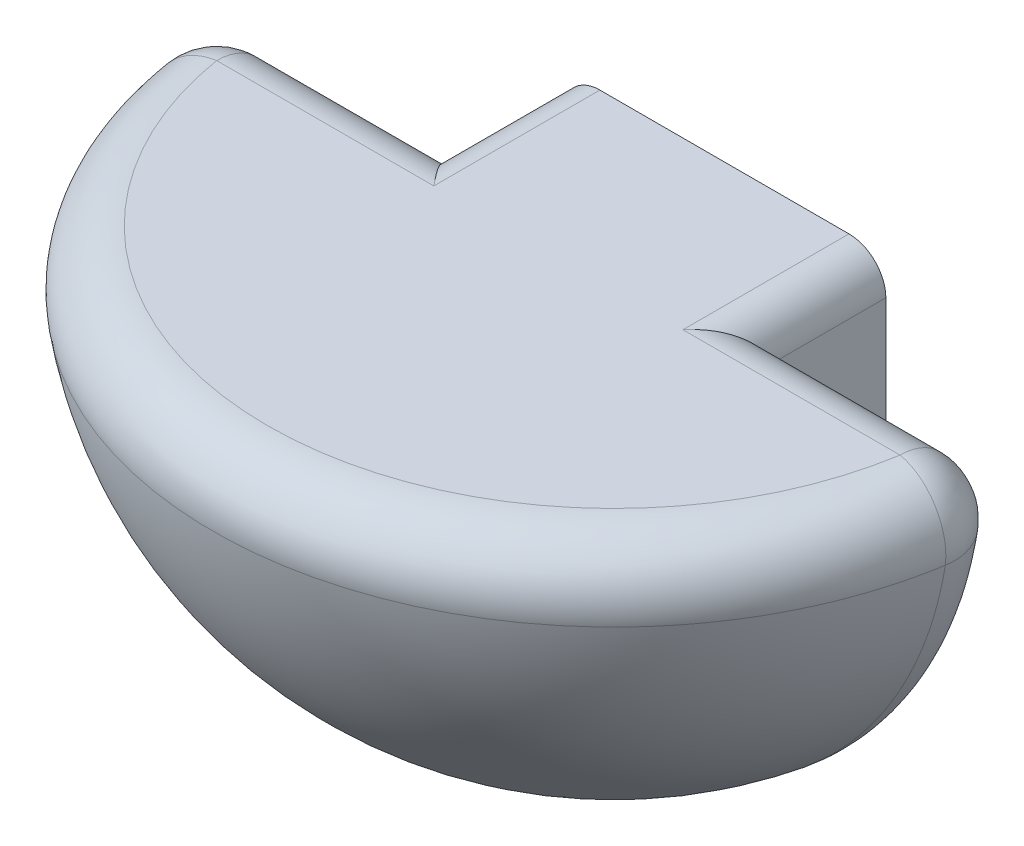
ISO-10303-21;
HEADER;
FILE_DESCRIPTION(('STEP AP214'),'2;1');
FILE_NAME('part.step','',(''),(''),'','','');
FILE_SCHEMA(('AUTOMOTIVE_DESIGN { 1 0 10303 214 1 1 1 1 }'));
ENDSEC;
DATA;
#1=APPLICATION_CONTEXT('core data for automotive mechanical design processes');
#2=APPLICATION_PROTOCOL_DEFINITION('international standard','automotive_design',2000,#1);
#3=PRODUCT_CONTEXT('',#1,'mechanical');
#4=PRODUCT('Part','Part','',(#3));
#5=PRODUCT_RELATED_PRODUCT_CATEGORY('part','',(#4));
#6=PRODUCT_DEFINITION_FORMATION('','',#4);
#7=PRODUCT_DEFINITION_CONTEXT('part definition',#1,'design');
#8=PRODUCT_DEFINITION('design','',#6,#7);
#9=PRODUCT_DEFINITION_SHAPE('','',#8);
#10=(LENGTH_UNIT() NAMED_UNIT(*) SI_UNIT(.MILLI.,.METRE.));
#11=(NAMED_UNIT(*) PLANE_ANGLE_UNIT() SI_UNIT($,.RADIAN.));
#12=(NAMED_UNIT(*) SI_UNIT($,.STERADIAN.) SOLID_ANGLE_UNIT());
#13=UNCERTAINTY_MEASURE_WITH_UNIT(LENGTH_MEASURE(1.E-05),#10,'distance_accuracy_value','');
#14=(GEOMETRIC_REPRESENTATION_CONTEXT(3) GLOBAL_UNCERTAINTY_ASSIGNED_CONTEXT((#13)) GLOBAL_UNIT_ASSIGNED_CONTEXT((#10,
#11,#12)) REPRESENTATION_CONTEXT('',''));
#15=CARTESIAN_POINT('',(0.,0.,0.));
#16=DIRECTION('',(0.,0.,1.));
#17=DIRECTION('',(1.,0.,0.));
#18=AXIS2_PLACEMENT_3D('',#15,#16,#17);
#19=CARTESIAN_POINT('',(0.,0.,0.));
#20=DIRECTION('',(0.,0.,1.));
#21=DIRECTION('',(1.,0.,0.));
#22=AXIS2_PLACEMENT_3D('',#19,#20,#21);
#23=PLANE('',#22);
#24=DIRECTION('',(-1.,0.,0.));
#25=VECTOR('',#24,1.);
#26=CARTESIAN_POINT('',(4.375,-8.75,0.));
#27=LINE('',#26,#25);
#28=CARTESIAN_POINT('',(3.375,-8.75,0.));
#29=VERTEX_POINT('',#28);
#30=CARTESIAN_POINT('',(-3.375,-8.75,0.));
#31=VERTEX_POINT('',#30);
#32=EDGE_CURVE('E263',#29,#31,#27,.T.);
#33=ORIENTED_EDGE('',*,*,#32,.F.);
#34=CARTESIAN_POINT('',(3.375,-7.75,0.));
#35=DIRECTION('',(0.,0.,1.));
#36=DIRECTION('',(1.,0.,0.));
#37=AXIS2_PLACEMENT_3D('',#34,#35,#36);
#38=CIRCLE('',#37,1.);
#39=CARTESIAN_POINT('',(3.38200071590122,-8.74997549468818,0.));
#40=VERTEX_POINT('',#39);
#41=EDGE_CURVE('E406',#29,#40,#38,.T.);
#42=ORIENTED_EDGE('',*,*,#41,.T.);
#43=CARTESIAN_POINT('',(0.,0.,0.));
#44=DIRECTION('',(0.,0.,1.));
#45=DIRECTION('',(1.,0.,0.));
#46=AXIS2_PLACEMENT_3D('',#43,#44,#45);
#47=CIRCLE('',#46,9.38083151964686);
#48=CARTESIAN_POINT('',(-3.38200071590122,-8.74997549468818,0.));
#49=VERTEX_POINT('',#48);
#50=EDGE_CURVE('E64',#40,#49,#47,.F.);
#51=ORIENTED_EDGE('',*,*,#50,.T.);
#52=CARTESIAN_POINT('',(-3.375,-7.75,0.));
#53=DIRECTION('',(0.,0.,1.));
#54=DIRECTION('',(1.,0.,0.));
#55=AXIS2_PLACEMENT_3D('',#52,#53,#54);
#56=CIRCLE('',#55,1.);
#57=EDGE_CURVE('E387',#49,#31,#56,.T.);
#58=ORIENTED_EDGE('',*,*,#57,.T.);
#59=EDGE_LOOP('',(#33,#42,#51,#58));
#60=FACE_BOUND('',#59,.T.);
#61=ADVANCED_FACE('F36',(#60),#23,.F.);
#62=DIRECTION('',(0.,1.,0.));
#63=VECTOR('',#62,1.);
#64=CARTESIAN_POINT('',(-4.375,0.,0.));
#65=LINE('',#64,#63);
#66=CARTESIAN_POINT('',(-4.375,-7.75,0.));
#67=VERTEX_POINT('',#66);
#68=CARTESIAN_POINT('',(-4.375,-1.5,0.));
#69=VERTEX_POINT('',#68);
#70=EDGE_CURVE('E251',#67,#69,#65,.T.);
#71=ORIENTED_EDGE('',*,*,#70,.F.);
#72=CARTESIAN_POINT('',(-3.375,-7.75,0.));
#73=DIRECTION('',(0.,0.,1.));
#74=DIRECTION('',(1.,0.,0.));
#75=AXIS2_PLACEMENT_3D('',#72,#73,#74);
#76=CIRCLE('',#75,1.);
#77=CARTESIAN_POINT('',(-4.10233669936263,-8.43628079221303,0.));
#78=VERTEX_POINT('',#77);
#79=EDGE_CURVE('E361',#67,#78,#76,.T.);
#80=ORIENTED_EDGE('',*,*,#79,.T.);
#81=CARTESIAN_POINT('',(0.,0.,0.));
#82=DIRECTION('',(0.,0.,1.));
#83=DIRECTION('',(1.,0.,0.));
#84=AXIS2_PLACEMENT_3D('',#81,#82,#83);
#85=CIRCLE('',#84,9.38083151964686);
#86=CARTESIAN_POINT('',(-9.26012958872607,-1.5,0.));
#87=VERTEX_POINT('',#86);
#88=EDGE_CURVE('E277',#78,#87,#85,.F.);
#89=ORIENTED_EDGE('',*,*,#88,.T.);
#90=DIRECTION('',(-1.,0.,0.));
#91=VECTOR('',#90,1.);
#92=CARTESIAN_POINT('',(-4.375,-1.5,0.));
#93=LINE('',#92,#91);
#94=EDGE_CURVE('E274',#87,#69,#93,.F.);
#95=ORIENTED_EDGE('',*,*,#94,.T.);
#96=EDGE_LOOP('',(#71,#80,#89,#95));
#97=FACE_BOUND('',#96,.T.);
#98=ADVANCED_FACE('F470',(#97),#23,.F.);
#99=DIRECTION('',(-1.,0.,0.));
#100=VECTOR('',#99,1.);
#101=CARTESIAN_POINT('',(11.,-1.5,0.));
#102=LINE('',#101,#100);
#103=CARTESIAN_POINT('',(4.375,-1.5,0.));
#104=VERTEX_POINT('',#103);
#105=CARTESIAN_POINT('',(9.26012958872607,-1.5,0.));
#106=VERTEX_POINT('',#105);
#107=EDGE_CURVE('E271',#104,#106,#102,.F.);
#108=ORIENTED_EDGE('',*,*,#107,.T.);
#109=CARTESIAN_POINT('',(0.,0.,0.));
#110=DIRECTION('',(0.,0.,1.));
#111=DIRECTION('',(1.,0.,0.));
#112=AXIS2_PLACEMENT_3D('',#109,#110,#111);
#113=CIRCLE('',#112,9.38083151964686);
#114=CARTESIAN_POINT('',(4.10233669936262,-8.43628079221304,0.));
#115=VERTEX_POINT('',#114);
#116=EDGE_CURVE('E57',#106,#115,#113,.F.);
#117=ORIENTED_EDGE('',*,*,#116,.T.);
#118=CARTESIAN_POINT('',(3.375,-7.75,0.));
#119=DIRECTION('',(0.,0.,1.));
#120=DIRECTION('',(1.,0.,0.));
#121=AXIS2_PLACEMENT_3D('',#118,#119,#120);
#122=CIRCLE('',#121,1.);
#123=CARTESIAN_POINT('',(4.375,-7.75,0.));
#124=VERTEX_POINT('',#123);
#125=EDGE_CURVE('E50',#115,#124,#122,.T.);
#126=ORIENTED_EDGE('',*,*,#125,.T.);
#127=DIRECTION('',(0.,-1.,0.));
#128=VECTOR('',#127,1.);
#129=CARTESIAN_POINT('',(4.375,0.,0.));
#130=LINE('',#129,#128);
#131=EDGE_CURVE('E246',#104,#124,#130,.T.);
#132=ORIENTED_EDGE('',*,*,#131,.F.);
#133=EDGE_LOOP('',(#108,#117,#126,#132));
#134=FACE_BOUND('',#133,.T.);
#135=ADVANCED_FACE('F409',(#134),#23,.F.);
#136=CARTESIAN_POINT('',(0.,0.,0.));
#137=DIRECTION('',(1.,0.,0.));
#138=DIRECTION('',(0.,0.,1.));
#139=AXIS2_PLACEMENT_3D('',#136,#137,#138);
#140=SPHERICAL_SURFACE('',#139,11.);
#141=CARTESIAN_POINT('',(0.,-1.73684210526316,0.));
#142=DIRECTION('',(0.,1.,0.));
#143=DIRECTION('',(0.,0.,1.));
#144=AXIS2_PLACEMENT_3D('',#141,#142,#143);
#145=CIRCLE('',#144,10.8620154438016);
#146=CARTESIAN_POINT('',(10.7222553132618,-1.73684210526315,1.73684210526316));
#147=VERTEX_POINT('',#146);
#148=CARTESIAN_POINT('',(-10.7222553132618,-1.73684210526315,1.73684210526316));
#149=VERTEX_POINT('',#148);
#150=EDGE_CURVE('E260',#147,#149,#145,.F.);
#151=ORIENTED_EDGE('',*,*,#150,.T.);
#152=CARTESIAN_POINT('',(0.,0.,1.73684210526316));
#153=DIRECTION('',(0.,0.,-1.));
#154=DIRECTION('',(-1.,0.,0.));
#155=AXIS2_PLACEMENT_3D('',#152,#153,#154);
#156=CIRCLE('',#155,10.8620154438016);
#157=EDGE_CURVE('E268',#149,#147,#156,.F.);
#158=ORIENTED_EDGE('',*,*,#157,.T.);
#159=EDGE_LOOP('',(#151,#158));
#160=FACE_BOUND('',#159,.T.);
#161=ADVANCED_FACE('F396',(#160),#140,.T.);
#162=CARTESIAN_POINT('',(0.,0.,0.));
#163=DIRECTION('',(0.,1.,0.));
#164=DIRECTION('',(1.,0.,0.));
#165=AXIS2_PLACEMENT_3D('',#162,#163,#164);
#166=PLANE('',#165);
#167=DIRECTION('',(1.,0.,0.));
#168=VECTOR('',#167,1.);
#169=CARTESIAN_POINT('',(4.375,0.,-3.));
#170=LINE('',#169,#168);
#171=CARTESIAN_POINT('',(-3.375,0.,-3.));
#172=VERTEX_POINT('',#171);
#173=CARTESIAN_POINT('',(3.375,0.,-3.));
#174=VERTEX_POINT('',#173);
#175=EDGE_CURVE('E257',#172,#174,#170,.T.);
#176=ORIENTED_EDGE('',*,*,#175,.F.);
#177=DIRECTION('',(0.,0.,1.));
#178=VECTOR('',#177,1.);
#179=CARTESIAN_POINT('',(-3.375,0.,1.49999999999999));
#180=LINE('',#179,#178);
#181=CARTESIAN_POINT('',(-3.375,0.,1.49999999999999));
#182=VERTEX_POINT('',#181);
#183=EDGE_CURVE('E327',#172,#182,#180,.T.);
#184=ORIENTED_EDGE('',*,*,#183,.T.);
#185=DIRECTION('',(-1.,0.,0.));
#186=VECTOR('',#185,1.);
#187=CARTESIAN_POINT('',(-11.,0.,1.49999999999999));
#188=LINE('',#187,#186);
#189=CARTESIAN_POINT('',(-9.26012958872607,0.,1.49999999999999));
#190=VERTEX_POINT('',#189);
#191=EDGE_CURVE('E284',#182,#190,#188,.T.);
#192=ORIENTED_EDGE('',*,*,#191,.T.);
#193=CARTESIAN_POINT('',(0.,0.,0.));
#194=DIRECTION('',(0.,1.,0.));
#195=DIRECTION('',(0.,0.,1.));
#196=AXIS2_PLACEMENT_3D('',#193,#194,#195);
#197=CIRCLE('',#196,9.38083151964686);
#198=CARTESIAN_POINT('',(9.26012958872607,0.,1.49999999999999));
#199=VERTEX_POINT('',#198);
#200=EDGE_CURVE('E280',#190,#199,#197,.T.);
#201=ORIENTED_EDGE('',*,*,#200,.T.);
#202=DIRECTION('',(-1.,0.,0.));
#203=VECTOR('',#202,1.);
#204=CARTESIAN_POINT('',(4.375,0.,1.49999999999999));
#205=LINE('',#204,#203);
#206=CARTESIAN_POINT('',(3.375,0.,1.49999999999999));
#207=VERTEX_POINT('',#206);
#208=EDGE_CURVE('E282',#199,#207,#205,.T.);
#209=ORIENTED_EDGE('',*,*,#208,.T.);
#210=DIRECTION('',(0.,0.,1.));
#211=VECTOR('',#210,1.);
#212=CARTESIAN_POINT('',(3.375,0.,-3.));
#213=LINE('',#212,#211);
#214=EDGE_CURVE('E325',#207,#174,#213,.F.);
#215=ORIENTED_EDGE('',*,*,#214,.T.);
#216=EDGE_LOOP('',(#176,#184,#192,#201,#209,#215));
#217=FACE_BOUND('',#216,.T.);
#218=ADVANCED_FACE('F444',(#217),#166,.T.);
#219=CARTESIAN_POINT('',(0.,0.,-3.));
#220=DIRECTION('',(0.,0.,-1.));
#221=DIRECTION('',(-1.,0.,0.));
#222=AXIS2_PLACEMENT_3D('',#219,#220,#221);
#223=PLANE('',#222);
#224=DIRECTION('',(0.,1.,0.));
#225=VECTOR('',#224,1.);
#226=CARTESIAN_POINT('',(-4.375,0.,-3.));
#227=LINE('',#226,#225);
#228=CARTESIAN_POINT('',(-4.375,-7.75,-3.));
#229=VERTEX_POINT('',#228);
#230=CARTESIAN_POINT('',(-4.375,-1.00000000000001,-3.));
#231=VERTEX_POINT('',#230);
#232=EDGE_CURVE('E254',#229,#231,#227,.T.);
#233=ORIENTED_EDGE('',*,*,#232,.T.);
#234=CARTESIAN_POINT('',(-3.375,-1.00000000000001,-3.));
#235=DIRECTION('',(0.,0.,-1.));
#236=DIRECTION('',(-1.,0.,0.));
#237=AXIS2_PLACEMENT_3D('',#234,#235,#236);
#238=CIRCLE('',#237,1.);
#239=EDGE_CURVE('E341',#231,#172,#238,.T.);
#240=ORIENTED_EDGE('',*,*,#239,.T.);
#241=ORIENTED_EDGE('',*,*,#175,.T.);
#242=CARTESIAN_POINT('',(3.375,-1.00000000000001,-3.));
#243=DIRECTION('',(0.,0.,-1.));
#244=DIRECTION('',(-1.,0.,0.));
#245=AXIS2_PLACEMENT_3D('',#242,#243,#244);
#246=CIRCLE('',#245,1.);
#247=CARTESIAN_POINT('',(4.375,-1.00000000000001,-3.));
#248=VERTEX_POINT('',#247);
#249=EDGE_CURVE('E335',#174,#248,#246,.T.);
#250=ORIENTED_EDGE('',*,*,#249,.T.);
#251=DIRECTION('',(0.,-1.,0.));
#252=VECTOR('',#251,1.);
#253=CARTESIAN_POINT('',(4.375,0.,-3.));
#254=LINE('',#253,#252);
#255=CARTESIAN_POINT('',(4.375,-7.75,-3.));
#256=VERTEX_POINT('',#255);
#257=EDGE_CURVE('E247',#248,#256,#254,.T.);
#258=ORIENTED_EDGE('',*,*,#257,.T.);
#259=CARTESIAN_POINT('',(3.375,-7.75,-3.));
#260=DIRECTION('',(0.,0.,-1.));
#261=DIRECTION('',(-1.,0.,0.));
#262=AXIS2_PLACEMENT_3D('',#259,#260,#261);
#263=CIRCLE('',#262,1.);
#264=CARTESIAN_POINT('',(3.375,-8.75,-3.));
#265=VERTEX_POINT('',#264);
#266=EDGE_CURVE('E337',#256,#265,#263,.T.);
#267=ORIENTED_EDGE('',*,*,#266,.T.);
#268=DIRECTION('',(-1.,0.,0.));
#269=VECTOR('',#268,1.);
#270=CARTESIAN_POINT('',(4.375,-8.75,-3.));
#271=LINE('',#270,#269);
#272=CARTESIAN_POINT('',(-3.375,-8.75,-3.));
#273=VERTEX_POINT('',#272);
#274=EDGE_CURVE('E250',#265,#273,#271,.T.);
#275=ORIENTED_EDGE('',*,*,#274,.T.);
#276=CARTESIAN_POINT('',(-3.375,-7.75,-3.));
#277=DIRECTION('',(0.,0.,-1.));
#278=DIRECTION('',(-1.,0.,0.));
#279=AXIS2_PLACEMENT_3D('',#276,#277,#278);
#280=CIRCLE('',#279,1.);
#281=EDGE_CURVE('E339',#273,#229,#280,.T.);
#282=ORIENTED_EDGE('',*,*,#281,.T.);
#283=EDGE_LOOP('',(#233,#240,#241,#250,#258,#267,#275,#282));
#284=FACE_BOUND('',#283,.T.);
#285=DIRECTION('',(-1.,0.,0.));
#286=VECTOR('',#285,1.);
#287=CARTESIAN_POINT('',(2.375,-6.75,-3.));
#288=LINE('',#287,#286);
#289=CARTESIAN_POINT('',(1.375,-6.75,-3.));
#290=VERTEX_POINT('',#289);
#291=CARTESIAN_POINT('',(-1.375,-6.75,-3.));
#292=VERTEX_POINT('',#291);
#293=EDGE_CURVE('E237',#290,#292,#288,.T.);
#294=ORIENTED_EDGE('',*,*,#293,.F.);
#295=CARTESIAN_POINT('',(1.375,-5.75,-3.));
#296=DIRECTION('',(0.,0.,-1.));
#297=DIRECTION('',(-1.,0.,0.));
#298=AXIS2_PLACEMENT_3D('',#295,#296,#297);
#299=CIRCLE('',#298,1.);
#300=CARTESIAN_POINT('',(2.375,-5.75,-3.));
#301=VERTEX_POINT('',#300);
#302=EDGE_CURVE('E198',#290,#301,#299,.F.);
#303=ORIENTED_EDGE('',*,*,#302,.T.);
#304=DIRECTION('',(0.,-1.,0.));
#305=VECTOR('',#304,1.);
#306=CARTESIAN_POINT('',(2.375,-2.,-3.));
#307=LINE('',#306,#305);
#308=CARTESIAN_POINT('',(2.375,-3.,-3.));
#309=VERTEX_POINT('',#308);
#310=EDGE_CURVE('E234',#309,#301,#307,.T.);
#311=ORIENTED_EDGE('',*,*,#310,.F.);
#312=CARTESIAN_POINT('',(1.375,-3.,-3.));
#313=DIRECTION('',(0.,0.,-1.));
#314=DIRECTION('',(-1.,0.,0.));
#315=AXIS2_PLACEMENT_3D('',#312,#313,#314);
#316=CIRCLE('',#315,1.);
#317=CARTESIAN_POINT('',(1.375,-2.,-3.));
#318=VERTEX_POINT('',#317);
#319=EDGE_CURVE('E320',#309,#318,#316,.F.);
#320=ORIENTED_EDGE('',*,*,#319,.T.);
#321=DIRECTION('',(1.,0.,0.));
#322=VECTOR('',#321,1.);
#323=CARTESIAN_POINT('',(2.375,-2.,-3.));
#324=LINE('',#323,#322);
#325=CARTESIAN_POINT('',(-1.375,-2.,-3.));
#326=VERTEX_POINT('',#325);
#327=EDGE_CURVE('E243',#326,#318,#324,.T.);
#328=ORIENTED_EDGE('',*,*,#327,.F.);
#329=CARTESIAN_POINT('',(-1.375,-3.,-3.));
#330=DIRECTION('',(0.,0.,-1.));
#331=DIRECTION('',(-1.,0.,0.));
#332=AXIS2_PLACEMENT_3D('',#329,#330,#331);
#333=CIRCLE('',#332,1.);
#334=CARTESIAN_POINT('',(-2.375,-3.,-3.));
#335=VERTEX_POINT('',#334);
#336=EDGE_CURVE('E318',#326,#335,#333,.F.);
#337=ORIENTED_EDGE('',*,*,#336,.T.);
#338=DIRECTION('',(0.,1.,0.));
#339=VECTOR('',#338,1.);
#340=CARTESIAN_POINT('',(-2.375,-2.,-3.));
#341=LINE('',#340,#339);
#342=CARTESIAN_POINT('',(-2.375,-5.75,-3.));
#343=VERTEX_POINT('',#342);
#344=EDGE_CURVE('E240',#343,#335,#341,.T.);
#345=ORIENTED_EDGE('',*,*,#344,.F.);
#346=CARTESIAN_POINT('',(-1.375,-5.75,-3.));
#347=DIRECTION('',(0.,0.,-1.));
#348=DIRECTION('',(-1.,0.,0.));
#349=AXIS2_PLACEMENT_3D('',#346,#347,#348);
#350=CIRCLE('',#349,1.);
#351=EDGE_CURVE('E322',#343,#292,#350,.F.);
#352=ORIENTED_EDGE('',*,*,#351,.T.);
#353=EDGE_LOOP('',(#294,#303,#311,#320,#328,#337,#345,#352));
#354=FACE_BOUND('',#353,.T.);
#355=ADVANCED_FACE('F422',(#284,#354),#223,.T.);
#356=CARTESIAN_POINT('',(4.375,0.,-3.));
#357=DIRECTION('',(-1.,0.,0.));
#358=DIRECTION('',(0.,-1.,0.));
#359=AXIS2_PLACEMENT_3D('',#356,#357,#358);
#360=PLANE('',#359);
#361=ORIENTED_EDGE('',*,*,#131,.T.);
#362=DIRECTION('',(0.,0.,1.));
#363=VECTOR('',#362,1.);
#364=CARTESIAN_POINT('',(4.375,-7.75,-3.));
#365=LINE('',#364,#363);
#366=EDGE_CURVE('E351',#124,#256,#365,.F.);
#367=ORIENTED_EDGE('',*,*,#366,.T.);
#368=ORIENTED_EDGE('',*,*,#257,.F.);
#369=DIRECTION('',(0.,0.,1.));
#370=VECTOR('',#369,1.);
#371=CARTESIAN_POINT('',(4.375,-0.999999999999997,1.5));
#372=LINE('',#371,#370);
#373=CARTESIAN_POINT('',(4.375,-1.,0.0857864376269033));
#374=VERTEX_POINT('',#373);
#375=EDGE_CURVE('E348',#248,#374,#372,.T.);
#376=ORIENTED_EDGE('',*,*,#375,.T.);
#377=CARTESIAN_POINT('',(4.375,-1.5,1.5));
#378=DIRECTION('',(-1.,0.,0.));
#379=DIRECTION('',(0.,-1.,0.));
#380=AXIS2_PLACEMENT_3D('',#377,#378,#379);
#381=CIRCLE('',#380,1.5);
#382=EDGE_CURVE('E289',#374,#104,#381,.T.);
#383=ORIENTED_EDGE('',*,*,#382,.T.);
#384=EDGE_LOOP('',(#361,#367,#368,#376,#383));
#385=FACE_BOUND('',#384,.T.);
#386=ADVANCED_FACE('F415',(#385),#360,.F.);
#387=CARTESIAN_POINT('',(4.375,-8.75,-3.));
#388=DIRECTION('',(0.,1.,0.));
#389=DIRECTION('',(0.,0.,1.));
#390=AXIS2_PLACEMENT_3D('',#387,#388,#389);
#391=PLANE('',#390);
#392=ORIENTED_EDGE('',*,*,#32,.T.);
#393=DIRECTION('',(0.,0.,1.));
#394=VECTOR('',#393,1.);
#395=CARTESIAN_POINT('',(-3.375,-8.75,-3.));
#396=LINE('',#395,#394);
#397=EDGE_CURVE('E346',#31,#273,#396,.F.);
#398=ORIENTED_EDGE('',*,*,#397,.T.);
#399=ORIENTED_EDGE('',*,*,#274,.F.);
#400=DIRECTION('',(0.,0.,1.));
#401=VECTOR('',#400,1.);
#402=CARTESIAN_POINT('',(3.375,-8.75,-3.));
#403=LINE('',#402,#401);
#404=EDGE_CURVE('E343',#265,#29,#403,.T.);
#405=ORIENTED_EDGE('',*,*,#404,.T.);
#406=EDGE_LOOP('',(#392,#398,#399,#405));
#407=FACE_BOUND('',#406,.T.);
#408=ADVANCED_FACE('F426',(#407),#391,.F.);
#409=CARTESIAN_POINT('',(-4.375,0.,-3.));
#410=DIRECTION('',(1.,0.,0.));
#411=DIRECTION('',(0.,1.,0.));
#412=AXIS2_PLACEMENT_3D('',#409,#410,#411);
#413=PLANE('',#412);
#414=CARTESIAN_POINT('',(-4.375,-1.5,1.5));
#415=DIRECTION('',(1.,0.,0.));
#416=DIRECTION('',(0.,1.,0.));
#417=AXIS2_PLACEMENT_3D('',#414,#415,#416);
#418=CIRCLE('',#417,1.5);
#419=CARTESIAN_POINT('',(-4.375,-1.,0.0857864376269033));
#420=VERTEX_POINT('',#419);
#421=EDGE_CURVE('E286',#69,#420,#418,.T.);
#422=ORIENTED_EDGE('',*,*,#421,.T.);
#423=DIRECTION('',(0.,0.,1.));
#424=VECTOR('',#423,1.);
#425=CARTESIAN_POINT('',(-4.375,-1.00000000000001,-3.));
#426=LINE('',#425,#424);
#427=EDGE_CURVE('E333',#420,#231,#426,.F.);
#428=ORIENTED_EDGE('',*,*,#427,.T.);
#429=ORIENTED_EDGE('',*,*,#232,.F.);
#430=DIRECTION('',(0.,0.,1.));
#431=VECTOR('',#430,1.);
#432=CARTESIAN_POINT('',(-4.375,-7.75,-3.));
#433=LINE('',#432,#431);
#434=EDGE_CURVE('E330',#229,#67,#433,.T.);
#435=ORIENTED_EDGE('',*,*,#434,.T.);
#436=ORIENTED_EDGE('',*,*,#70,.T.);
#437=EDGE_LOOP('',(#422,#428,#429,#435,#436));
#438=FACE_BOUND('',#437,.T.);
#439=ADVANCED_FACE('F435',(#438),#413,.F.);
#440=CARTESIAN_POINT('',(2.375,-2.,-3.));
#441=DIRECTION('',(-1.,0.,0.));
#442=DIRECTION('',(0.,-1.,0.));
#443=AXIS2_PLACEMENT_3D('',#440,#441,#442);
#444=PLANE('',#443);
#445=DIRECTION('',(0.,0.,1.));
#446=VECTOR('',#445,1.);
#447=CARTESIAN_POINT('',(2.375,-5.75,0.));
#448=LINE('',#447,#446);
#449=CARTESIAN_POINT('',(2.375,-5.75,4.5));
#450=VERTEX_POINT('',#449);
#451=EDGE_CURVE('E314',#301,#450,#448,.T.);
#452=ORIENTED_EDGE('',*,*,#451,.T.);
#453=DIRECTION('',(0.,-1.,0.));
#454=VECTOR('',#453,1.);
#455=CARTESIAN_POINT('',(2.375,-3.,4.5));
#456=LINE('',#455,#454);
#457=CARTESIAN_POINT('',(2.375,-3.,4.5));
#458=VERTEX_POINT('',#457);
#459=EDGE_CURVE('E217',#458,#450,#456,.T.);
#460=ORIENTED_EDGE('',*,*,#459,.F.);
#461=DIRECTION('',(0.,0.,1.));
#462=VECTOR('',#461,1.);
#463=CARTESIAN_POINT('',(2.375,-3.,-3.));
#464=LINE('',#463,#462);
#465=EDGE_CURVE('E203',#458,#309,#464,.F.);
#466=ORIENTED_EDGE('',*,*,#465,.T.);
#467=ORIENTED_EDGE('',*,*,#310,.T.);
#468=EDGE_LOOP('',(#452,#460,#466,#467));
#469=FACE_BOUND('',#468,.T.);
#470=ADVANCED_FACE('F530',(#469),#444,.T.);
#471=CARTESIAN_POINT('',(2.375,-6.75,-3.));
#472=DIRECTION('',(0.,1.,0.));
#473=DIRECTION('',(0.,0.,1.));
#474=AXIS2_PLACEMENT_3D('',#471,#472,#473);
#475=PLANE('',#474);
#476=ORIENTED_EDGE('',*,*,#293,.T.);
#477=DIRECTION('',(0.,0.,1.));
#478=VECTOR('',#477,1.);
#479=CARTESIAN_POINT('',(-1.375,-6.75,0.));
#480=LINE('',#479,#478);
#481=CARTESIAN_POINT('',(-1.375,-6.75,4.5));
#482=VERTEX_POINT('',#481);
#483=EDGE_CURVE('E202',#292,#482,#480,.T.);
#484=ORIENTED_EDGE('',*,*,#483,.T.);
#485=DIRECTION('',(-1.,0.,0.));
#486=VECTOR('',#485,1.);
#487=CARTESIAN_POINT('',(1.375,-6.75,4.5));
#488=LINE('',#487,#486);
#489=CARTESIAN_POINT('',(1.375,-6.75,4.5));
#490=VERTEX_POINT('',#489);
#491=EDGE_CURVE('E206',#490,#482,#488,.T.);
#492=ORIENTED_EDGE('',*,*,#491,.F.);
#493=DIRECTION('',(0.,0.,1.));
#494=VECTOR('',#493,1.);
#495=CARTESIAN_POINT('',(1.375,-6.75,-3.));
#496=LINE('',#495,#494);
#497=EDGE_CURVE('E191',#490,#290,#496,.F.);
#498=ORIENTED_EDGE('',*,*,#497,.T.);
#499=EDGE_LOOP('',(#476,#484,#492,#498));
#500=FACE_BOUND('',#499,.T.);
#501=ADVANCED_FACE('F207',(#500),#475,.T.);
#502=CARTESIAN_POINT('',(-2.375,-2.,-3.));
#503=DIRECTION('',(1.,0.,0.));
#504=DIRECTION('',(0.,1.,0.));
#505=AXIS2_PLACEMENT_3D('',#502,#503,#504);
#506=PLANE('',#505);
#507=ORIENTED_EDGE('',*,*,#344,.T.);
#508=DIRECTION('',(0.,0.,1.));
#509=VECTOR('',#508,1.);
#510=CARTESIAN_POINT('',(-2.375,-3.,0.));
#511=LINE('',#510,#509);
#512=CARTESIAN_POINT('',(-2.375,-3.,4.5));
#513=VERTEX_POINT('',#512);
#514=EDGE_CURVE('E308',#335,#513,#511,.T.);
#515=ORIENTED_EDGE('',*,*,#514,.T.);
#516=DIRECTION('',(0.,1.,0.));
#517=VECTOR('',#516,1.);
#518=CARTESIAN_POINT('',(-2.375,-5.75,4.5));
#519=LINE('',#518,#517);
#520=CARTESIAN_POINT('',(-2.375,-5.75,4.5));
#521=VERTEX_POINT('',#520);
#522=EDGE_CURVE('E221',#521,#513,#519,.T.);
#523=ORIENTED_EDGE('',*,*,#522,.F.);
#524=DIRECTION('',(0.,0.,1.));
#525=VECTOR('',#524,1.);
#526=CARTESIAN_POINT('',(-2.375,-5.75,-3.));
#527=LINE('',#526,#525);
#528=EDGE_CURVE('E291',#521,#343,#527,.F.);
#529=ORIENTED_EDGE('',*,*,#528,.T.);
#530=EDGE_LOOP('',(#507,#515,#523,#529));
#531=FACE_BOUND('',#530,.T.);
#532=ADVANCED_FACE('F609',(#531),#506,.T.);
#533=CARTESIAN_POINT('',(2.375,-2.,-3.));
#534=DIRECTION('',(0.,-1.,0.));
#535=DIRECTION('',(0.,0.,-1.));
#536=AXIS2_PLACEMENT_3D('',#533,#534,#535);
#537=PLANE('',#536);
#538=DIRECTION('',(0.,0.,1.));
#539=VECTOR('',#538,1.);
#540=CARTESIAN_POINT('',(1.375,-2.,0.));
#541=LINE('',#540,#539);
#542=CARTESIAN_POINT('',(1.375,-2.,4.5));
#543=VERTEX_POINT('',#542);
#544=EDGE_CURVE('E310',#318,#543,#541,.T.);
#545=ORIENTED_EDGE('',*,*,#544,.T.);
#546=DIRECTION('',(1.,0.,0.));
#547=VECTOR('',#546,1.);
#548=CARTESIAN_POINT('',(-1.375,-2.,4.5));
#549=LINE('',#548,#547);
#550=CARTESIAN_POINT('',(-1.375,-2.,4.5));
#551=VERTEX_POINT('',#550);
#552=EDGE_CURVE('E227',#551,#543,#549,.T.);
#553=ORIENTED_EDGE('',*,*,#552,.F.);
#554=DIRECTION('',(0.,0.,1.));
#555=VECTOR('',#554,1.);
#556=CARTESIAN_POINT('',(-1.375,-2.,-3.));
#557=LINE('',#556,#555);
#558=EDGE_CURVE('E312',#551,#326,#557,.F.);
#559=ORIENTED_EDGE('',*,*,#558,.T.);
#560=ORIENTED_EDGE('',*,*,#327,.T.);
#561=EDGE_LOOP('',(#545,#553,#559,#560));
#562=FACE_BOUND('',#561,.T.);
#563=ADVANCED_FACE('F541',(#562),#537,.T.);
#564=CARTESIAN_POINT('',(0.,-1.5,1.5));
#565=DIRECTION('',(1.,0.,0.));
#566=DIRECTION('',(0.,0.,-1.));
#567=AXIS2_PLACEMENT_3D('',#564,#565,#566);
#568=CYLINDRICAL_SURFACE('',#567,1.5);
#569=ORIENTED_EDGE('',*,*,#421,.F.);
#570=ORIENTED_EDGE('',*,*,#94,.F.);
#571=CARTESIAN_POINT('',(-9.26012958872607,-1.5,1.5));
#572=DIRECTION('',(-1.,0.,0.));
#573=DIRECTION('',(0.,0.,1.));
#574=AXIS2_PLACEMENT_3D('',#571,#572,#573);
#575=CIRCLE('',#574,1.5);
#576=EDGE_CURVE('E238',#190,#87,#575,.T.);
#577=ORIENTED_EDGE('',*,*,#576,.F.);
#578=ORIENTED_EDGE('',*,*,#191,.F.);
#579=CARTESIAN_POINT('',(-4.375,-1.,0.0857864376269035));
#580=CARTESIAN_POINT('',(-4.37500245659851,-0.971802901974473,0.0957504327267925));
#581=CARTESIAN_POINT('',(-4.37380738021847,-0.943931978712709,0.106558505063544));
#582=CARTESIAN_POINT('',(-4.36920892277159,-0.889076938486538,0.129724464543538));
#583=CARTESIAN_POINT('',(-4.36580892299368,-0.862091530029374,0.142079955323218));
#584=CARTESIAN_POINT('',(-4.35266945656256,-0.783253180051374,0.181030276949366));
#585=CARTESIAN_POINT('',(-4.33998221575533,-0.732906887924708,0.209727667231376));
#586=CARTESIAN_POINT('',(-4.30465091279108,-0.62638981734038,0.278646388267308));
#587=CARTESIAN_POINT('',(-4.28039604673932,-0.571509006005012,0.320003304038154));
#588=CARTESIAN_POINT('',(-4.22479362246476,-0.469684797266699,0.407755851029772));
#589=CARTESIAN_POINT('',(-4.19341463302554,-0.422778236017532,0.454173322564945));
#590=CARTESIAN_POINT('',(-4.11246395896117,-0.320363597821427,0.569158931155962));
#591=CARTESIAN_POINT('',(-4.06054984805897,-0.268545272277028,0.639350763509645));
#592=CARTESIAN_POINT('',(-3.95064976120977,-0.17923838957407,0.783882988558085));
#593=CARTESIAN_POINT('',(-3.89265547030922,-0.141769790759839,0.85822899570253));
#594=CARTESIAN_POINT('',(-3.76066383639467,-0.0737953538098999,1.02498671923757));
#595=CARTESIAN_POINT('',(-3.68583244466787,-0.046318212592527,1.11796258206983));
#596=CARTESIAN_POINT('',(-3.53393375238207,-0.00963451881458027,1.30533492378494));
#597=CARTESIAN_POINT('',(-3.45687162415319,-0.000388675138542192,1.39972790488185));
#598=CARTESIAN_POINT('',(-3.37826593999989,-4.00859319633417E-06,1.49600005576983));
#599=CARTESIAN_POINT('',(-3.37663294372978,-9.23299383343867E-09,1.49800005952657));
#600=CARTESIAN_POINT('',(-3.375,0.,1.49999999999999));
#601=B_SPLINE_CURVE_WITH_KNOTS('',3,(#579,#580,#581,#582,#583,#584,#585,#586,#587,#588,#589,
#590,#591,#592,#593,#594,#595,#596,#597,#598,#599,#600),.UNSPECIFIED.,.F.,.F.,(4,2,2,2,2,2,2,2,
2,2,4),(0.,0.089636155681015,0.179135176748013,0.356215461300309,0.57367778427353,
0.792118854178609,1.09504447244105,1.39838989836241,1.76428338223859,2.12938744646442,
2.13713342245208),.UNSPECIFIED.);
#602=EDGE_CURVE('E353',#182,#420,#601,.F.);
#603=ORIENTED_EDGE('',*,*,#602,.T.);
#604=EDGE_LOOP('',(#569,#570,#577,#578,#603));
#605=FACE_BOUND('',#604,.T.);
#606=ADVANCED_FACE('F363',(#605),#568,.T.);
#607=CARTESIAN_POINT('',(0.,-1.5,0.));
#608=DIRECTION('',(0.,1.,0.));
#609=DIRECTION('',(0.,0.,1.));
#610=AXIS2_PLACEMENT_3D('',#607,#608,#609);
#611=TOROIDAL_SURFACE('',#610,9.38083151964686,1.5);
#612=CARTESIAN_POINT('',(9.26012958872607,-1.5,1.5));
#613=DIRECTION('',(0.159900537266708,0.,-0.987133130931091));
#614=DIRECTION('',(-0.987133130931091,0.,-0.159900537266708));
#615=AXIS2_PLACEMENT_3D('',#612,#613,#614);
#616=CIRCLE('',#615,1.5);
#617=EDGE_CURVE('E299',#199,#147,#616,.T.);
#618=ORIENTED_EDGE('',*,*,#617,.F.);
#619=ORIENTED_EDGE('',*,*,#200,.F.);
#620=CARTESIAN_POINT('',(-9.26012958872607,-1.5,1.5));
#621=DIRECTION('',(-0.159900537266708,0.,-0.987133130931091));
#622=DIRECTION('',(-0.987133130931091,0.,0.159900537266708));
#623=AXIS2_PLACEMENT_3D('',#620,#621,#622);
#624=CIRCLE('',#623,1.5);
#625=EDGE_CURVE('E302',#149,#190,#624,.T.);
#626=ORIENTED_EDGE('',*,*,#625,.F.);
#627=ORIENTED_EDGE('',*,*,#150,.F.);
#628=EDGE_LOOP('',(#618,#619,#626,#627));
#629=FACE_BOUND('',#628,.T.);
#630=ADVANCED_FACE('F460',(#629),#611,.T.);
#631=CARTESIAN_POINT('',(0.,-1.5,1.5));
#632=DIRECTION('',(1.,0.,0.));
#633=DIRECTION('',(0.,0.,-1.));
#634=AXIS2_PLACEMENT_3D('',#631,#632,#633);
#635=CYLINDRICAL_SURFACE('',#634,1.5);
#636=ORIENTED_EDGE('',*,*,#382,.F.);
#637=CARTESIAN_POINT('',(4.375,-1.,0.0857864376269033));
#638=CARTESIAN_POINT('',(4.3750024565985,-0.971802901974474,0.0957504327267924));
#639=CARTESIAN_POINT('',(4.37380738021847,-0.943931978712709,0.106558505063543));
#640=CARTESIAN_POINT('',(4.36920892277159,-0.889076938486539,0.129724464543538));
#641=CARTESIAN_POINT('',(4.36580892299368,-0.862091530029375,0.142079955323217));
#642=CARTESIAN_POINT('',(4.35266945656256,-0.783253180051374,0.181030276949366));
#643=CARTESIAN_POINT('',(4.33998221575533,-0.732906887924708,0.209727667231376));
#644=CARTESIAN_POINT('',(4.30465091279108,-0.62638981734038,0.278646388267307));
#645=CARTESIAN_POINT('',(4.28039604673931,-0.571509006005013,0.320003304038154));
#646=CARTESIAN_POINT('',(4.22479362246476,-0.4696847972667,0.407755851029771));
#647=CARTESIAN_POINT('',(4.19341463302554,-0.422778236017533,0.454173322564944));
#648=CARTESIAN_POINT('',(4.11246395896117,-0.320363597821428,0.569158931155961));
#649=CARTESIAN_POINT('',(4.06054984805897,-0.268545272277029,0.639350763509644));
#650=CARTESIAN_POINT('',(3.95064976120978,-0.17923838957407,0.783882988558083));
#651=CARTESIAN_POINT('',(3.89265547030922,-0.14176979075984,0.858228995702528));
#652=CARTESIAN_POINT('',(3.76066383639467,-0.0737953538099001,1.02498671923757));
#653=CARTESIAN_POINT('',(3.68583244466787,-0.0463182125925267,1.11796258206983));
#654=CARTESIAN_POINT('',(3.53393375238207,-0.00963451881458057,1.30533492378494));
#655=CARTESIAN_POINT('',(3.45687162415318,-0.000388675138543728,1.39972790488184));
#656=CARTESIAN_POINT('',(3.37826593999989,-4.00859319639906E-06,1.49600005576983));
#657=CARTESIAN_POINT('',(3.37663294372978,-9.23299386657223E-09,1.49800005952657));
#658=CARTESIAN_POINT('',(3.375,0.,1.49999999999999));
#659=B_SPLINE_CURVE_WITH_KNOTS('',3,(#637,#638,#639,#640,#641,#642,#643,#644,#645,#646,#647,
#648,#649,#650,#651,#652,#653,#654,#655,#656,#657,#658),.UNSPECIFIED.,.F.,.F.,(4,2,2,2,2,2,2,2,
2,2,4),(0.,0.0896361556810148,0.179135176748013,0.356215461300309,0.57367778427353,
0.792118854178608,1.09504447244105,1.3983898983624,1.76428338223859,2.12938744646442,
2.13713342245208),.UNSPECIFIED.);
#660=EDGE_CURVE('E11',#374,#207,#659,.T.);
#661=ORIENTED_EDGE('',*,*,#660,.T.);
#662=ORIENTED_EDGE('',*,*,#208,.F.);
#663=CARTESIAN_POINT('',(9.26012958872607,-1.5,1.5));
#664=DIRECTION('',(1.,0.,0.));
#665=DIRECTION('',(0.,1.,0.));
#666=AXIS2_PLACEMENT_3D('',#663,#664,#665);
#667=CIRCLE('',#666,1.5);
#668=EDGE_CURVE('E296',#106,#199,#667,.T.);
#669=ORIENTED_EDGE('',*,*,#668,.F.);
#670=ORIENTED_EDGE('',*,*,#107,.F.);
#671=EDGE_LOOP('',(#636,#661,#662,#669,#670));
#672=FACE_BOUND('',#671,.T.);
#673=ADVANCED_FACE('F450',(#672),#635,.T.);
#674=CARTESIAN_POINT('',(-9.26012958872607,-1.5,1.5));
#675=DIRECTION('',(0.,0.,1.));
#676=DIRECTION('',(1.,0.,0.));
#677=AXIS2_PLACEMENT_3D('',#674,#675,#676);
#678=SPHERICAL_SURFACE('',#677,1.5);
#679=ORIENTED_EDGE('',*,*,#625,.T.);
#680=ORIENTED_EDGE('',*,*,#576,.T.);
#681=CARTESIAN_POINT('',(-9.26012958872607,-1.5,1.5));
#682=DIRECTION('',(-0.159900537266707,0.987133130931091,0.));
#683=DIRECTION('',(-0.987133130931091,-0.159900537266707,0.));
#684=AXIS2_PLACEMENT_3D('',#681,#682,#683);
#685=CIRCLE('',#684,1.5);
#686=EDGE_CURVE('E293',#149,#87,#685,.F.);
#687=ORIENTED_EDGE('',*,*,#686,.F.);
#688=EDGE_LOOP('',(#679,#680,#687));
#689=FACE_BOUND('',#688,.T.);
#690=ADVANCED_FACE('F465',(#689),#678,.T.);
#691=CARTESIAN_POINT('',(9.26012958872607,-1.5,1.5));
#692=DIRECTION('',(0.,0.,1.));
#693=DIRECTION('',(1.,0.,0.));
#694=AXIS2_PLACEMENT_3D('',#691,#692,#693);
#695=SPHERICAL_SURFACE('',#694,1.5);
#696=ORIENTED_EDGE('',*,*,#668,.T.);
#697=ORIENTED_EDGE('',*,*,#617,.T.);
#698=CARTESIAN_POINT('',(9.26012958872607,-1.5,1.5));
#699=DIRECTION('',(0.159900537266707,0.987133130931091,0.));
#700=DIRECTION('',(-0.987133130931091,0.159900537266707,0.));
#701=AXIS2_PLACEMENT_3D('',#698,#699,#700);
#702=CIRCLE('',#701,1.5);
#703=EDGE_CURVE('E233',#106,#147,#702,.F.);
#704=ORIENTED_EDGE('',*,*,#703,.F.);
#705=EDGE_LOOP('',(#696,#697,#704));
#706=FACE_BOUND('',#705,.T.);
#707=ADVANCED_FACE('F395',(#706),#695,.T.);
#708=CARTESIAN_POINT('',(0.,0.,1.5));
#709=DIRECTION('',(0.,0.,1.));
#710=DIRECTION('',(1.,0.,0.));
#711=AXIS2_PLACEMENT_3D('',#708,#709,#710);
#712=TOROIDAL_SURFACE('',#711,9.38083151964686,1.5);
#713=ORIENTED_EDGE('',*,*,#50,.F.);
#714=CARTESIAN_POINT('',(3.38200071590122,-8.74997549468818,0.));
#715=CARTESIAN_POINT('',(3.41011264685417,-8.74977828371886,2.81568442433948E-06));
#716=CARTESIAN_POINT('',(3.43820206274386,-8.74839570832449,9.85767284650118E-05));
#717=CARTESIAN_POINT('',(3.49416416599339,-8.74327257695461,0.000381255983092752));
#718=CARTESIAN_POINT('',(3.52203685651556,-8.73953205545051,0.000568172861041026));
#719=CARTESIAN_POINT('',(3.60504559630593,-8.72479759206937,0.00112338047510252));
#720=CARTESIAN_POINT('',(3.65960103538129,-8.71029052537062,0.0014863222715542));
#721=CARTESIAN_POINT('',(3.76550625708919,-8.67232206211996,0.00180015917646417));
#722=CARTESIAN_POINT('',(3.81685370782047,-8.64885423808382,0.00175075798255659));
#723=CARTESIAN_POINT('',(3.91481909168181,-8.59364929107921,0.00128687338023838));
#724=CARTESIAN_POINT('',(3.96144533677181,-8.56192706491281,0.00087304448272122));
#725=CARTESIAN_POINT('',(4.02224443421738,-8.51260629047468,0.000380857749447609));
#726=CARTESIAN_POINT('',(4.03898127991618,-8.49807803100889,0.000251038802402405));
#727=CARTESIAN_POINT('',(4.07143209068742,-8.46796271374144,6.09637731037105E-05));
#728=CARTESIAN_POINT('',(4.08714740327023,-8.45237710856606,6.14221136509687E-07));
#729=CARTESIAN_POINT('',(4.10233669936253,-8.43628079221294,0.));
#730=B_SPLINE_CURVE_WITH_KNOTS('',3,(#714,#715,#716,#717,#718,#719,#720,#721,#722,#723,#724,
#725,#726,#727,#728,#729),.UNSPECIFIED.,.F.,.F.,(4,2,2,2,2,2,2,4),(0.,0.0842847504550068,
0.168568268758912,0.337050228903896,0.505653267616947,0.673954112019557,0.740405298653997,
0.806766971623331),.UNSPECIFIED.);
#731=EDGE_CURVE('E401',#40,#115,#730,.T.);
#732=ORIENTED_EDGE('',*,*,#731,.T.);
#733=ORIENTED_EDGE('',*,*,#116,.F.);
#734=ORIENTED_EDGE('',*,*,#703,.T.);
#735=ORIENTED_EDGE('',*,*,#157,.F.);
#736=ORIENTED_EDGE('',*,*,#686,.T.);
#737=ORIENTED_EDGE('',*,*,#88,.F.);
#738=CARTESIAN_POINT('',(-4.10233669936263,-8.43628079221305,0.));
#739=CARTESIAN_POINT('',(-4.08304325364998,-8.45672785817867,2.81568442344022E-06));
#740=CARTESIAN_POINT('',(-4.06289731161699,-8.47635100316994,9.85767284635057E-05));
#741=CARTESIAN_POINT('',(-4.02102672437696,-8.51383243056164,0.000381255983090475));
#742=CARTESIAN_POINT('',(-3.99930210225314,-8.53169073875823,0.000568172861038592));
#743=CARTESIAN_POINT('',(-3.93197142045849,-8.58242666864803,0.00112338047510005));
#744=CARTESIAN_POINT('',(-3.88418881559797,-8.61248616946976,0.00148632227155227));
#745=CARTESIAN_POINT('',(-3.78425153578532,-8.66415879559099,0.00180015917646393));
#746=CARTESIAN_POINT('',(-3.73209374354807,-8.68576583542827,0.00175075798255755));
#747=CARTESIAN_POINT('',(-3.6249456278036,-8.71988450921978,0.0012868733802407));
#748=CARTESIAN_POINT('',(-3.56996054871757,-8.73241237583974,0.00087304448272372));
#749=CARTESIAN_POINT('',(-3.49243701026103,-8.74332887832674,0.000380857749449629));
#750=CARTESIAN_POINT('',(-3.47039986024065,-8.74568606860964,0.000251038802404215));
#751=CARTESIAN_POINT('',(-3.426247146975,-8.74893035051958,6.09637731048044E-05));
#752=CARTESIAN_POINT('',(-3.40413172934487,-8.74981941817887,6.14221137100675E-07));
#753=CARTESIAN_POINT('',(-3.38200071590122,-8.74997549468818,0.));
#754=B_SPLINE_CURVE_WITH_KNOTS('',3,(#738,#739,#740,#741,#742,#743,#744,#745,#746,#747,#748,
#749,#750,#751,#752,#753),.UNSPECIFIED.,.F.,.F.,(4,2,2,2,2,2,2,4),(0.,0.0842847504550005,
0.168568268758905,0.337050228903902,0.505653267616955,0.673954112019565,0.740405298653997,
0.806766971623325),.UNSPECIFIED.);
#755=EDGE_CURVE('E380',#78,#49,#754,.T.);
#756=ORIENTED_EDGE('',*,*,#755,.T.);
#757=EDGE_LOOP('',(#713,#732,#733,#734,#735,#736,#737,#756));
#758=FACE_BOUND('',#757,.T.);
#759=ADVANCED_FACE('F389',(#758),#712,.T.);
#760=CARTESIAN_POINT('',(-1.375,-3.,-3.));
#761=DIRECTION('',(0.,0.,-1.));
#762=DIRECTION('',(-1.,0.,0.));
#763=AXIS2_PLACEMENT_3D('',#760,#761,#762);
#764=CYLINDRICAL_SURFACE('',#763,1.);
#765=ORIENTED_EDGE('',*,*,#336,.F.);
#766=ORIENTED_EDGE('',*,*,#558,.F.);
#767=CARTESIAN_POINT('',(-1.375,-3.,4.5));
#768=DIRECTION('',(0.,0.,-1.));
#769=DIRECTION('',(-1.,0.,0.));
#770=AXIS2_PLACEMENT_3D('',#767,#768,#769);
#771=CIRCLE('',#770,1.);
#772=EDGE_CURVE('E224',#513,#551,#771,.T.);
#773=ORIENTED_EDGE('',*,*,#772,.F.);
#774=ORIENTED_EDGE('',*,*,#514,.F.);
#775=EDGE_LOOP('',(#765,#766,#773,#774));
#776=FACE_BOUND('',#775,.T.);
#777=ADVANCED_FACE('F394',(#776),#764,.F.);
#778=CARTESIAN_POINT('',(1.375,-3.,-3.));
#779=DIRECTION('',(0.,0.,-1.));
#780=DIRECTION('',(-1.,0.,0.));
#781=AXIS2_PLACEMENT_3D('',#778,#779,#780);
#782=CYLINDRICAL_SURFACE('',#781,1.);
#783=ORIENTED_EDGE('',*,*,#319,.F.);
#784=ORIENTED_EDGE('',*,*,#465,.F.);
#785=CARTESIAN_POINT('',(1.375,-3.,4.5));
#786=DIRECTION('',(0.,0.,-1.));
#787=DIRECTION('',(-1.,0.,0.));
#788=AXIS2_PLACEMENT_3D('',#785,#786,#787);
#789=CIRCLE('',#788,1.);
#790=EDGE_CURVE('E230',#543,#458,#789,.T.);
#791=ORIENTED_EDGE('',*,*,#790,.F.);
#792=ORIENTED_EDGE('',*,*,#544,.F.);
#793=EDGE_LOOP('',(#783,#784,#791,#792));
#794=FACE_BOUND('',#793,.T.);
#795=ADVANCED_FACE('F637',(#794),#782,.F.);
#796=CARTESIAN_POINT('',(-1.375,-5.75,-3.));
#797=DIRECTION('',(0.,0.,-1.));
#798=DIRECTION('',(-1.,0.,0.));
#799=AXIS2_PLACEMENT_3D('',#796,#797,#798);
#800=CYLINDRICAL_SURFACE('',#799,1.);
#801=ORIENTED_EDGE('',*,*,#351,.F.);
#802=ORIENTED_EDGE('',*,*,#528,.F.);
#803=CARTESIAN_POINT('',(-1.375,-5.75,4.5));
#804=DIRECTION('',(0.,0.,-1.));
#805=DIRECTION('',(-1.,0.,0.));
#806=AXIS2_PLACEMENT_3D('',#803,#804,#805);
#807=CIRCLE('',#806,1.);
#808=EDGE_CURVE('E212',#482,#521,#807,.T.);
#809=ORIENTED_EDGE('',*,*,#808,.F.);
#810=ORIENTED_EDGE('',*,*,#483,.F.);
#811=EDGE_LOOP('',(#801,#802,#809,#810));
#812=FACE_BOUND('',#811,.T.);
#813=ADVANCED_FACE('F646',(#812),#800,.F.);
#814=CARTESIAN_POINT('',(1.375,-5.75,-3.));
#815=DIRECTION('',(0.,0.,-1.));
#816=DIRECTION('',(-1.,0.,0.));
#817=AXIS2_PLACEMENT_3D('',#814,#815,#816);
#818=CYLINDRICAL_SURFACE('',#817,1.);
#819=ORIENTED_EDGE('',*,*,#302,.F.);
#820=ORIENTED_EDGE('',*,*,#497,.F.);
#821=CARTESIAN_POINT('',(1.375,-5.75,4.5));
#822=DIRECTION('',(0.,0.,-1.));
#823=DIRECTION('',(-1.,0.,0.));
#824=AXIS2_PLACEMENT_3D('',#821,#822,#823);
#825=CIRCLE('',#824,1.);
#826=EDGE_CURVE('E196',#450,#490,#825,.T.);
#827=ORIENTED_EDGE('',*,*,#826,.F.);
#828=ORIENTED_EDGE('',*,*,#451,.F.);
#829=EDGE_LOOP('',(#819,#820,#827,#828));
#830=FACE_BOUND('',#829,.T.);
#831=ADVANCED_FACE('F193',(#830),#818,.F.);
#832=CARTESIAN_POINT('',(-3.375,-1.,0.));
#833=DIRECTION('',(0.,0.,-1.));
#834=DIRECTION('',(0.,1.,0.));
#835=AXIS2_PLACEMENT_3D('',#832,#833,#834);
#836=CYLINDRICAL_SURFACE('',#835,1.);
#837=ORIENTED_EDGE('',*,*,#239,.F.);
#838=ORIENTED_EDGE('',*,*,#427,.F.);
#839=ORIENTED_EDGE('',*,*,#602,.F.);
#840=ORIENTED_EDGE('',*,*,#183,.F.);
#841=EDGE_LOOP('',(#837,#838,#839,#840));
#842=FACE_BOUND('',#841,.T.);
#843=ADVANCED_FACE('F367',(#842),#836,.T.);
#844=CARTESIAN_POINT('',(-3.375,-7.75,-3.));
#845=DIRECTION('',(0.,0.,1.));
#846=DIRECTION('',(1.,0.,0.));
#847=AXIS2_PLACEMENT_3D('',#844,#845,#846);
#848=CYLINDRICAL_SURFACE('',#847,1.);
#849=ORIENTED_EDGE('',*,*,#281,.F.);
#850=ORIENTED_EDGE('',*,*,#397,.F.);
#851=ORIENTED_EDGE('',*,*,#57,.F.);
#852=ORIENTED_EDGE('',*,*,#755,.F.);
#853=ORIENTED_EDGE('',*,*,#79,.F.);
#854=ORIENTED_EDGE('',*,*,#434,.F.);
#855=EDGE_LOOP('',(#849,#850,#851,#852,#853,#854));
#856=FACE_BOUND('',#855,.T.);
#857=ADVANCED_FACE('F372',(#856),#848,.T.);
#858=CARTESIAN_POINT('',(3.375,-7.75,-3.));
#859=DIRECTION('',(0.,0.,1.));
#860=DIRECTION('',(1.,0.,0.));
#861=AXIS2_PLACEMENT_3D('',#858,#859,#860);
#862=CYLINDRICAL_SURFACE('',#861,1.);
#863=ORIENTED_EDGE('',*,*,#266,.F.);
#864=ORIENTED_EDGE('',*,*,#366,.F.);
#865=ORIENTED_EDGE('',*,*,#125,.F.);
#866=ORIENTED_EDGE('',*,*,#731,.F.);
#867=ORIENTED_EDGE('',*,*,#41,.F.);
#868=ORIENTED_EDGE('',*,*,#404,.F.);
#869=EDGE_LOOP('',(#863,#864,#865,#866,#867,#868));
#870=FACE_BOUND('',#869,.T.);
#871=ADVANCED_FACE('F377',(#870),#862,.T.);
#872=CARTESIAN_POINT('',(3.375,-1.00000000000001,-3.));
#873=DIRECTION('',(0.,0.,-1.));
#874=DIRECTION('',(0.,1.,0.));
#875=AXIS2_PLACEMENT_3D('',#872,#873,#874);
#876=CYLINDRICAL_SURFACE('',#875,1.);
#877=ORIENTED_EDGE('',*,*,#249,.F.);
#878=ORIENTED_EDGE('',*,*,#214,.F.);
#879=ORIENTED_EDGE('',*,*,#660,.F.);
#880=ORIENTED_EDGE('',*,*,#375,.F.);
#881=EDGE_LOOP('',(#877,#878,#879,#880));
#882=FACE_BOUND('',#881,.T.);
#883=ADVANCED_FACE('F38',(#882),#876,.T.);
#884=CARTESIAN_POINT('',(1.375,-5.75,4.5));
#885=DIRECTION('',(0.,0.,-1.));
#886=DIRECTION('',(-1.,0.,0.));
#887=AXIS2_PLACEMENT_3D('',#884,#885,#886);
#888=PLANE('',#887);
#889=ORIENTED_EDGE('',*,*,#826,.T.);
#890=ORIENTED_EDGE('',*,*,#491,.T.);
#891=ORIENTED_EDGE('',*,*,#808,.T.);
#892=ORIENTED_EDGE('',*,*,#522,.T.);
#893=ORIENTED_EDGE('',*,*,#772,.T.);
#894=ORIENTED_EDGE('',*,*,#552,.T.);
#895=ORIENTED_EDGE('',*,*,#790,.T.);
#896=ORIENTED_EDGE('',*,*,#459,.T.);
#897=EDGE_LOOP('',(#889,#890,#891,#892,#893,#894,#895,#896));
#898=FACE_BOUND('',#897,.T.);
#899=ADVANCED_FACE('F214',(#898),#888,.T.);
#900=CLOSED_SHELL('',(#61,#98,#135,#161,#218,#355,#386,#408,#439,#470,#501,#532,#563,#606,#630,
#673,#690,#707,#759,#777,#795,#813,#831,#843,#857,#871,#883,#899));
#901=MANIFOLD_SOLID_BREP('B2',#900);
#902=ADVANCED_BREP_SHAPE_REPRESENTATION('',(#18,#901),#14);
#903=SHAPE_DEFINITION_REPRESENTATION(#9,#902);
ENDSEC;
END-ISO-10303-21;
